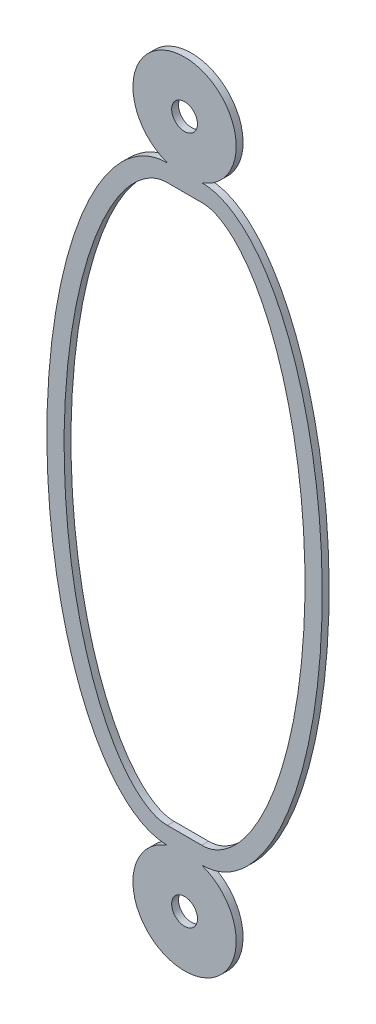
ISO-10303-21;
HEADER;
FILE_DESCRIPTION(('STEP AP214'),'2;1');
FILE_NAME('part.step','',(''),(''),'','','');
FILE_SCHEMA(('AUTOMOTIVE_DESIGN { 1 0 10303 214 1 1 1 1 }'));
ENDSEC;
DATA;
#1=APPLICATION_CONTEXT('core data for automotive mechanical design processes');
#2=APPLICATION_PROTOCOL_DEFINITION('international standard','automotive_design',2000,#1);
#3=PRODUCT_CONTEXT('',#1,'mechanical');
#4=PRODUCT('Part','Part','',(#3));
#5=PRODUCT_RELATED_PRODUCT_CATEGORY('part','',(#4));
#6=PRODUCT_DEFINITION_FORMATION('','',#4);
#7=PRODUCT_DEFINITION_CONTEXT('part definition',#1,'design');
#8=PRODUCT_DEFINITION('design','',#6,#7);
#9=PRODUCT_DEFINITION_SHAPE('','',#8);
#10=(LENGTH_UNIT() NAMED_UNIT(*) SI_UNIT(.MILLI.,.METRE.));
#11=(NAMED_UNIT(*) PLANE_ANGLE_UNIT() SI_UNIT($,.RADIAN.));
#12=(NAMED_UNIT(*) SI_UNIT($,.STERADIAN.) SOLID_ANGLE_UNIT());
#13=UNCERTAINTY_MEASURE_WITH_UNIT(LENGTH_MEASURE(1.E-05),#10,'distance_accuracy_value','');
#14=(GEOMETRIC_REPRESENTATION_CONTEXT(3) GLOBAL_UNCERTAINTY_ASSIGNED_CONTEXT((#13)) GLOBAL_UNIT_ASSIGNED_CONTEXT((#10,
#11,#12)) REPRESENTATION_CONTEXT('',''));
#15=CARTESIAN_POINT('',(0.,0.,0.));
#16=DIRECTION('',(0.,0.,1.));
#17=DIRECTION('',(1.,0.,0.));
#18=AXIS2_PLACEMENT_3D('',#15,#16,#17);
#19=CARTESIAN_POINT('',(-0.500000000000001,0.,0.1));
#20=DIRECTION('',(0.,0.,1.));
#21=DIRECTION('',(1.,0.,0.));
#22=AXIS2_PLACEMENT_3D('',#19,#20,#21);
#23=PLANE('',#22);
#24=CARTESIAN_POINT('',(0.,10.,0.1));
#25=DIRECTION('',(0.,0.,1.));
#26=DIRECTION('',(1.,0.,0.));
#27=AXIS2_PLACEMENT_3D('',#24,#25,#26);
#28=CIRCLE('',#27,0.375000000000001);
#29=CARTESIAN_POINT('',(0.375,10.,0.1));
#30=VERTEX_POINT('',#29);
#31=EDGE_CURVE('E184',#30,#30,#28,.T.);
#32=ORIENTED_EDGE('',*,*,#31,.F.);
#33=EDGE_LOOP('',(#32));
#34=FACE_BOUND('',#33,.T.);
#35=CARTESIAN_POINT('',(-0.500000000000001,0.,0.1));
#36=DIRECTION('',(0.,0.,1.));
#37=DIRECTION('',(0.,1.,0.));
#38=AXIS2_PLACEMENT_3D('',#35,#36,#37);
#39=ELLIPSE('',#38,8.5857864376269,3.5);
#40=CARTESIAN_POINT('',(-0.500000000000002,8.5857864376269,0.1));
#41=VERTEX_POINT('',#40);
#42=CARTESIAN_POINT('',(-0.500000000000001,-8.5857864376269,0.1));
#43=VERTEX_POINT('',#42);
#44=EDGE_CURVE('E190',#41,#43,#39,.T.);
#45=ORIENTED_EDGE('',*,*,#44,.T.);
#46=CARTESIAN_POINT('',(0.,-10.,0.1));
#47=DIRECTION('',(0.,0.,1.));
#48=DIRECTION('',(1.,0.,0.));
#49=AXIS2_PLACEMENT_3D('',#46,#47,#48);
#50=CIRCLE('',#49,1.5);
#51=CARTESIAN_POINT('',(0.499999999999999,-8.5857864376269,0.1));
#52=VERTEX_POINT('',#51);
#53=EDGE_CURVE('E177',#43,#52,#50,.T.);
#54=ORIENTED_EDGE('',*,*,#53,.T.);
#55=CARTESIAN_POINT('',(0.499999999999999,0.,0.1));
#56=DIRECTION('',(0.,0.,1.));
#57=DIRECTION('',(0.,1.,0.));
#58=AXIS2_PLACEMENT_3D('',#55,#56,#57);
#59=ELLIPSE('',#58,8.5857864376269,3.5);
#60=CARTESIAN_POINT('',(0.499999999999999,8.5857864376269,0.1));
#61=VERTEX_POINT('',#60);
#62=EDGE_CURVE('E172',#52,#61,#59,.T.);
#63=ORIENTED_EDGE('',*,*,#62,.T.);
#64=CARTESIAN_POINT('',(0.,10.,0.1));
#65=DIRECTION('',(0.,0.,1.));
#66=DIRECTION('',(1.,0.,0.));
#67=AXIS2_PLACEMENT_3D('',#64,#65,#66);
#68=CIRCLE('',#67,1.5);
#69=EDGE_CURVE('E176',#61,#41,#68,.T.);
#70=ORIENTED_EDGE('',*,*,#69,.T.);
#71=EDGE_LOOP('',(#45,#54,#63,#70));
#72=FACE_BOUND('',#71,.T.);
#73=CARTESIAN_POINT('',(0.,-10.,0.1));
#74=DIRECTION('',(0.,0.,1.));
#75=DIRECTION('',(1.,0.,0.));
#76=AXIS2_PLACEMENT_3D('',#73,#74,#75);
#77=CIRCLE('',#76,0.375);
#78=CARTESIAN_POINT('',(0.375000000000006,-10.,0.1));
#79=VERTEX_POINT('',#78);
#80=EDGE_CURVE('E217',#79,#79,#77,.T.);
#81=ORIENTED_EDGE('',*,*,#80,.F.);
#82=EDGE_LOOP('',(#81));
#83=FACE_BOUND('',#82,.T.);
#84=DIRECTION('',(1.,0.,0.));
#85=VECTOR('',#84,1.);
#86=CARTESIAN_POINT('',(-0.500000000000001,-8.08578643762691,0.1));
#87=LINE('',#86,#85);
#88=CARTESIAN_POINT('',(-0.500000000000001,-8.08578643762691,0.1));
#89=VERTEX_POINT('',#88);
#90=CARTESIAN_POINT('',(0.5,-8.0857864376269,0.1));
#91=VERTEX_POINT('',#90);
#92=EDGE_CURVE('E110',#89,#91,#87,.T.);
#93=ORIENTED_EDGE('',*,*,#92,.F.);
#94=CARTESIAN_POINT('',(-0.500000000000001,8.0857864376269,0.1));
#95=CARTESIAN_POINT('',(-0.659147925726962,8.0857864376269,0.1));
#96=CARTESIAN_POINT('',(-0.94590993674264,8.01836726312393,0.1));
#97=CARTESIAN_POINT('',(-1.48190681272366,7.63575974394931,0.1));
#98=CARTESIAN_POINT('',(-2.02462270649366,6.92767469065392,0.1));
#99=CARTESIAN_POINT('',(-2.69255409919081,5.58946200738258,0.1));
#100=CARTESIAN_POINT('',(-3.32190291475356,3.2913111898813,0.1));
#101=CARTESIAN_POINT('',(-3.58904854262322,0.,0.1));
#102=CARTESIAN_POINT('',(-3.32190291475355,-3.2913111898813,0.1));
#103=CARTESIAN_POINT('',(-2.69255409919081,-5.58946200738258,0.1));
#104=CARTESIAN_POINT('',(-2.02462270649366,-6.92767469065392,0.1));
#105=CARTESIAN_POINT('',(-1.48190681272366,-7.63575974394932,0.1));
#106=CARTESIAN_POINT('',(-0.945909936742641,-8.01836726312393,0.1));
#107=CARTESIAN_POINT('',(-0.659147925726963,-8.08578643762691,0.1));
#108=CARTESIAN_POINT('',(-0.500000000000001,-8.08578643762691,0.1));
#109=B_SPLINE_CURVE_WITH_KNOTS('',3,(#94,#95,#96,#97,#98,#99,#100,#101,#102,#103,#104,#105,#106,
#107,#108),.UNSPECIFIED.,.F.,.F.,(4,1,1,1,1,1,1,1,1,1,1,1,4),(0.,0.196349540849362,
0.392699081698724,0.589048622548086,0.785398163397448,1.17809724509617,1.5707963267949,
1.96349540849362,2.35619449019234,2.55254403104171,2.74889357189107,2.94524311274043,
3.14159265358979),.UNSPECIFIED.);
#110=CARTESIAN_POINT('',(-0.500000000000001,8.0857864376269,0.1));
#111=VERTEX_POINT('',#110);
#112=EDGE_CURVE('E102',#111,#89,#109,.T.);
#113=ORIENTED_EDGE('',*,*,#112,.F.);
#114=DIRECTION('',(-1.,0.,0.));
#115=VECTOR('',#114,1.);
#116=CARTESIAN_POINT('',(-0.500000000000001,8.0857864376269,0.1));
#117=LINE('',#116,#115);
#118=CARTESIAN_POINT('',(0.5,8.0857864376269,0.1));
#119=VERTEX_POINT('',#118);
#120=EDGE_CURVE('E124',#119,#111,#117,.T.);
#121=ORIENTED_EDGE('',*,*,#120,.F.);
#122=CARTESIAN_POINT('',(0.5,-8.0857864376269,0.1));
#123=CARTESIAN_POINT('',(0.659147925726961,-8.0857864376269,0.1));
#124=CARTESIAN_POINT('',(0.94590993674264,-8.01836726312392,0.1));
#125=CARTESIAN_POINT('',(1.48190681272366,-7.63575974394931,0.1));
#126=CARTESIAN_POINT('',(2.02462270649366,-6.92767469065392,0.1));
#127=CARTESIAN_POINT('',(2.69255409919081,-5.58946200738257,0.1));
#128=CARTESIAN_POINT('',(3.32190291475355,-3.2913111898813,0.1));
#129=CARTESIAN_POINT('',(3.58904854262322,0.,0.1));
#130=CARTESIAN_POINT('',(3.32190291475355,3.2913111898813,0.1));
#131=CARTESIAN_POINT('',(2.6925540991908,5.58946200738258,0.1));
#132=CARTESIAN_POINT('',(2.02462270649366,6.92767469065392,0.1));
#133=CARTESIAN_POINT('',(1.48190681272366,7.63575974394931,0.1));
#134=CARTESIAN_POINT('',(0.945909936742639,8.01836726312393,0.1));
#135=CARTESIAN_POINT('',(0.659147925726961,8.0857864376269,0.1));
#136=CARTESIAN_POINT('',(0.499999999999999,8.0857864376269,0.1));
#137=B_SPLINE_CURVE_WITH_KNOTS('',3,(#122,#123,#124,#125,#126,#127,#128,#129,#130,#131,#132,
#133,#134,#135,#136),.UNSPECIFIED.,.F.,.F.,(4,1,1,1,1,1,1,1,1,1,1,1,4),(-3.14159265358979,
-2.94524311274043,-2.74889357189107,-2.55254403104171,-2.35619449019234,-1.96349540849362,
-1.5707963267949,-1.17809724509617,-0.785398163397448,-0.589048622548086,-0.392699081698724,
-0.196349540849362,0.),.UNSPECIFIED.);
#138=EDGE_CURVE('E122',#91,#119,#137,.T.);
#139=ORIENTED_EDGE('',*,*,#138,.F.);
#140=EDGE_LOOP('',(#93,#113,#121,#139));
#141=FACE_BOUND('',#140,.T.);
#142=ADVANCED_FACE('F36',(#34,#72,#83,#141),#23,.T.);
#143=CARTESIAN_POINT('',(-0.500000000000001,0.,-0.1));
#144=DIRECTION('',(0.,0.,1.));
#145=DIRECTION('',(1.,0.,0.));
#146=AXIS2_PLACEMENT_3D('',#143,#144,#145);
#147=PLANE('',#146);
#148=CARTESIAN_POINT('',(0.,-10.,-0.1));
#149=DIRECTION('',(0.,0.,1.));
#150=DIRECTION('',(1.,0.,0.));
#151=AXIS2_PLACEMENT_3D('',#148,#149,#150);
#152=CIRCLE('',#151,0.375);
#153=CARTESIAN_POINT('',(0.375000000000006,-10.,-0.1));
#154=VERTEX_POINT('',#153);
#155=EDGE_CURVE('E118',#154,#154,#152,.T.);
#156=ORIENTED_EDGE('',*,*,#155,.T.);
#157=EDGE_LOOP('',(#156));
#158=FACE_BOUND('',#157,.T.);
#159=CARTESIAN_POINT('',(0.,10.,-0.1));
#160=DIRECTION('',(0.,0.,1.));
#161=DIRECTION('',(1.,0.,0.));
#162=AXIS2_PLACEMENT_3D('',#159,#160,#161);
#163=CIRCLE('',#162,0.375000000000001);
#164=CARTESIAN_POINT('',(0.375,10.,-0.1));
#165=VERTEX_POINT('',#164);
#166=EDGE_CURVE('E214',#165,#165,#163,.T.);
#167=ORIENTED_EDGE('',*,*,#166,.T.);
#168=EDGE_LOOP('',(#167));
#169=FACE_BOUND('',#168,.T.);
#170=CARTESIAN_POINT('',(-0.500000000000001,0.,-0.1));
#171=DIRECTION('',(0.,0.,1.));
#172=DIRECTION('',(0.,1.,0.));
#173=AXIS2_PLACEMENT_3D('',#170,#171,#172);
#174=ELLIPSE('',#173,8.5857864376269,3.5);
#175=CARTESIAN_POINT('',(-0.500000000000002,8.5857864376269,-0.1));
#176=VERTEX_POINT('',#175);
#177=CARTESIAN_POINT('',(-0.500000000000001,-8.5857864376269,-0.1));
#178=VERTEX_POINT('',#177);
#179=EDGE_CURVE('E180',#176,#178,#174,.T.);
#180=ORIENTED_EDGE('',*,*,#179,.F.);
#181=CARTESIAN_POINT('',(0.,10.,-0.1));
#182=DIRECTION('',(0.,0.,1.));
#183=DIRECTION('',(1.,0.,0.));
#184=AXIS2_PLACEMENT_3D('',#181,#182,#183);
#185=CIRCLE('',#184,1.5);
#186=CARTESIAN_POINT('',(0.499999999999999,8.5857864376269,-0.1));
#187=VERTEX_POINT('',#186);
#188=EDGE_CURVE('E188',#187,#176,#185,.T.);
#189=ORIENTED_EDGE('',*,*,#188,.F.);
#190=CARTESIAN_POINT('',(0.499999999999999,0.,-0.1));
#191=DIRECTION('',(0.,0.,1.));
#192=DIRECTION('',(0.,1.,0.));
#193=AXIS2_PLACEMENT_3D('',#190,#191,#192);
#194=ELLIPSE('',#193,8.5857864376269,3.5);
#195=CARTESIAN_POINT('',(0.499999999999999,-8.5857864376269,-0.1));
#196=VERTEX_POINT('',#195);
#197=EDGE_CURVE('E186',#196,#187,#194,.T.);
#198=ORIENTED_EDGE('',*,*,#197,.F.);
#199=CARTESIAN_POINT('',(0.,-10.,-0.1));
#200=DIRECTION('',(0.,0.,1.));
#201=DIRECTION('',(1.,0.,0.));
#202=AXIS2_PLACEMENT_3D('',#199,#200,#201);
#203=CIRCLE('',#202,1.5);
#204=EDGE_CURVE('E183',#178,#196,#203,.T.);
#205=ORIENTED_EDGE('',*,*,#204,.F.);
#206=EDGE_LOOP('',(#180,#189,#198,#205));
#207=FACE_BOUND('',#206,.T.);
#208=CARTESIAN_POINT('',(-0.500000000000001,8.0857864376269,-0.1));
#209=CARTESIAN_POINT('',(-0.659147925726962,8.0857864376269,-0.1));
#210=CARTESIAN_POINT('',(-0.94590993674264,8.01836726312393,-0.1));
#211=CARTESIAN_POINT('',(-1.48190681272366,7.63575974394931,-0.1));
#212=CARTESIAN_POINT('',(-2.02462270649366,6.92767469065392,-0.1));
#213=CARTESIAN_POINT('',(-2.69255409919081,5.58946200738258,-0.1));
#214=CARTESIAN_POINT('',(-3.32190291475356,3.2913111898813,-0.1));
#215=CARTESIAN_POINT('',(-3.58904854262322,0.,-0.1));
#216=CARTESIAN_POINT('',(-3.32190291475355,-3.2913111898813,-0.1));
#217=CARTESIAN_POINT('',(-2.69255409919081,-5.58946200738258,-0.1));
#218=CARTESIAN_POINT('',(-2.02462270649366,-6.92767469065392,-0.1));
#219=CARTESIAN_POINT('',(-1.48190681272366,-7.63575974394932,-0.1));
#220=CARTESIAN_POINT('',(-0.945909936742641,-8.01836726312393,-0.1));
#221=CARTESIAN_POINT('',(-0.659147925726963,-8.08578643762691,-0.1));
#222=CARTESIAN_POINT('',(-0.500000000000001,-8.08578643762691,-0.1));
#223=B_SPLINE_CURVE_WITH_KNOTS('',3,(#208,#209,#210,#211,#212,#213,#214,#215,#216,#217,#218,
#219,#220,#221,#222),.UNSPECIFIED.,.F.,.F.,(4,1,1,1,1,1,1,1,1,1,1,1,4),(0.,0.196349540849362,
0.392699081698724,0.589048622548086,0.785398163397448,1.17809724509617,1.5707963267949,
1.96349540849362,2.35619449019234,2.55254403104171,2.74889357189107,2.94524311274043,
3.14159265358979),.UNSPECIFIED.);
#224=CARTESIAN_POINT('',(-0.500000000000001,8.0857864376269,-0.1));
#225=VERTEX_POINT('',#224);
#226=CARTESIAN_POINT('',(-0.500000000000001,-8.08578643762691,-0.1));
#227=VERTEX_POINT('',#226);
#228=EDGE_CURVE('E60',#225,#227,#223,.T.);
#229=ORIENTED_EDGE('',*,*,#228,.T.);
#230=DIRECTION('',(1.,0.,0.));
#231=VECTOR('',#230,1.);
#232=CARTESIAN_POINT('',(-0.500000000000001,-8.08578643762691,-0.1));
#233=LINE('',#232,#231);
#234=CARTESIAN_POINT('',(0.5,-8.0857864376269,-0.1));
#235=VERTEX_POINT('',#234);
#236=EDGE_CURVE('E117',#227,#235,#233,.T.);
#237=ORIENTED_EDGE('',*,*,#236,.T.);
#238=CARTESIAN_POINT('',(0.5,-8.0857864376269,-0.1));
#239=CARTESIAN_POINT('',(0.659147925726961,-8.0857864376269,-0.1));
#240=CARTESIAN_POINT('',(0.94590993674264,-8.01836726312392,-0.1));
#241=CARTESIAN_POINT('',(1.48190681272366,-7.63575974394931,-0.1));
#242=CARTESIAN_POINT('',(2.02462270649366,-6.92767469065392,-0.1));
#243=CARTESIAN_POINT('',(2.69255409919081,-5.58946200738257,-0.1));
#244=CARTESIAN_POINT('',(3.32190291475355,-3.2913111898813,-0.1));
#245=CARTESIAN_POINT('',(3.58904854262322,0.,-0.1));
#246=CARTESIAN_POINT('',(3.32190291475355,3.2913111898813,-0.1));
#247=CARTESIAN_POINT('',(2.6925540991908,5.58946200738258,-0.1));
#248=CARTESIAN_POINT('',(2.02462270649366,6.92767469065392,-0.1));
#249=CARTESIAN_POINT('',(1.48190681272366,7.63575974394931,-0.1));
#250=CARTESIAN_POINT('',(0.945909936742639,8.01836726312393,-0.1));
#251=CARTESIAN_POINT('',(0.659147925726961,8.0857864376269,-0.1));
#252=CARTESIAN_POINT('',(0.499999999999999,8.0857864376269,-0.1));
#253=B_SPLINE_CURVE_WITH_KNOTS('',3,(#238,#239,#240,#241,#242,#243,#244,#245,#246,#247,#248,
#249,#250,#251,#252),.UNSPECIFIED.,.F.,.F.,(4,1,1,1,1,1,1,1,1,1,1,1,4),(-3.14159265358979,
-2.94524311274043,-2.74889357189107,-2.55254403104171,-2.35619449019234,-1.96349540849362,
-1.5707963267949,-1.17809724509617,-0.785398163397448,-0.589048622548086,-0.392699081698724,
-0.196349540849362,0.),.UNSPECIFIED.);
#254=CARTESIAN_POINT('',(0.499999999999999,8.0857864376269,-0.1));
#255=VERTEX_POINT('',#254);
#256=EDGE_CURVE('E229',#235,#255,#253,.T.);
#257=ORIENTED_EDGE('',*,*,#256,.T.);
#258=DIRECTION('',(-1.,0.,0.));
#259=VECTOR('',#258,1.);
#260=CARTESIAN_POINT('',(-0.500000000000001,8.0857864376269,-0.1));
#261=LINE('',#260,#259);
#262=EDGE_CURVE('E111',#255,#225,#261,.T.);
#263=ORIENTED_EDGE('',*,*,#262,.T.);
#264=EDGE_LOOP('',(#229,#237,#257,#263));
#265=FACE_BOUND('',#264,.T.);
#266=ADVANCED_FACE('F159',(#158,#169,#207,#265),#147,.F.);
#267=DIRECTION('',(0.,0.,-1.));
#268=VECTOR('',#267,1.);
#269=SURFACE_OF_LINEAR_EXTRUSION('',#39,#268);
#270=ORIENTED_EDGE('',*,*,#179,.T.);
#271=DIRECTION('',(0.,0.,-1.));
#272=VECTOR('',#271,1.);
#273=CARTESIAN_POINT('',(-0.500000000000001,-8.5857864376269,0.1));
#274=LINE('',#273,#272);
#275=EDGE_CURVE('E11',#43,#178,#274,.T.);
#276=ORIENTED_EDGE('',*,*,#275,.F.);
#277=ORIENTED_EDGE('',*,*,#44,.F.);
#278=DIRECTION('',(0.,0.,-1.));
#279=VECTOR('',#278,1.);
#280=CARTESIAN_POINT('',(-0.500000000000002,8.5857864376269,0.1));
#281=LINE('',#280,#279);
#282=EDGE_CURVE('E179',#41,#176,#281,.T.);
#283=ORIENTED_EDGE('',*,*,#282,.T.);
#284=EDGE_LOOP('',(#270,#276,#277,#283));
#285=FACE_BOUND('',#284,.T.);
#286=ADVANCED_FACE('F38',(#285),#269,.F.);
#287=CARTESIAN_POINT('',(0.,-10.,0.1));
#288=DIRECTION('',(0.,0.,-1.));
#289=DIRECTION('',(-1.,0.,0.));
#290=AXIS2_PLACEMENT_3D('',#287,#288,#289);
#291=CYLINDRICAL_SURFACE('',#290,1.5);
#292=ORIENTED_EDGE('',*,*,#204,.T.);
#293=DIRECTION('',(0.,0.,-1.));
#294=VECTOR('',#293,1.);
#295=CARTESIAN_POINT('',(0.499999999999999,-8.5857864376269,0.1));
#296=LINE('',#295,#294);
#297=EDGE_CURVE('E45',#52,#196,#296,.T.);
#298=ORIENTED_EDGE('',*,*,#297,.F.);
#299=ORIENTED_EDGE('',*,*,#53,.F.);
#300=ORIENTED_EDGE('',*,*,#275,.T.);
#301=EDGE_LOOP('',(#292,#298,#299,#300));
#302=FACE_BOUND('',#301,.T.);
#303=ADVANCED_FACE('F170',(#302),#291,.T.);
#304=DIRECTION('',(0.,0.,-1.));
#305=VECTOR('',#304,1.);
#306=SURFACE_OF_LINEAR_EXTRUSION('',#59,#305);
#307=ORIENTED_EDGE('',*,*,#197,.T.);
#308=DIRECTION('',(0.,0.,-1.));
#309=VECTOR('',#308,1.);
#310=CARTESIAN_POINT('',(0.499999999999999,8.5857864376269,0.1));
#311=LINE('',#310,#309);
#312=EDGE_CURVE('E193',#61,#187,#311,.T.);
#313=ORIENTED_EDGE('',*,*,#312,.F.);
#314=ORIENTED_EDGE('',*,*,#62,.F.);
#315=ORIENTED_EDGE('',*,*,#297,.T.);
#316=EDGE_LOOP('',(#307,#313,#314,#315));
#317=FACE_BOUND('',#316,.T.);
#318=ADVANCED_FACE('F166',(#317),#306,.F.);
#319=CARTESIAN_POINT('',(0.,10.,0.1));
#320=DIRECTION('',(0.,0.,-1.));
#321=DIRECTION('',(-1.,0.,0.));
#322=AXIS2_PLACEMENT_3D('',#319,#320,#321);
#323=CYLINDRICAL_SURFACE('',#322,1.5);
#324=ORIENTED_EDGE('',*,*,#188,.T.);
#325=ORIENTED_EDGE('',*,*,#282,.F.);
#326=ORIENTED_EDGE('',*,*,#69,.F.);
#327=ORIENTED_EDGE('',*,*,#312,.T.);
#328=EDGE_LOOP('',(#324,#325,#326,#327));
#329=FACE_BOUND('',#328,.T.);
#330=ADVANCED_FACE('F155',(#329),#323,.T.);
#331=CARTESIAN_POINT('',(0.,10.,0.1));
#332=DIRECTION('',(0.,0.,-1.));
#333=DIRECTION('',(-1.,0.,0.));
#334=AXIS2_PLACEMENT_3D('',#331,#332,#333);
#335=CYLINDRICAL_SURFACE('',#334,0.375000000000001);
#336=ORIENTED_EDGE('',*,*,#31,.T.);
#337=EDGE_LOOP('',(#336));
#338=FACE_BOUND('',#337,.T.);
#339=ORIENTED_EDGE('',*,*,#166,.F.);
#340=EDGE_LOOP('',(#339));
#341=FACE_BOUND('',#340,.T.);
#342=ADVANCED_FACE('F151',(#338,#341),#335,.F.);
#343=CARTESIAN_POINT('',(0.,-10.,0.1));
#344=DIRECTION('',(0.,0.,-1.));
#345=DIRECTION('',(-1.,0.,0.));
#346=AXIS2_PLACEMENT_3D('',#343,#344,#345);
#347=CYLINDRICAL_SURFACE('',#346,0.375);
#348=ORIENTED_EDGE('',*,*,#80,.T.);
#349=EDGE_LOOP('',(#348));
#350=FACE_BOUND('',#349,.T.);
#351=ORIENTED_EDGE('',*,*,#155,.F.);
#352=EDGE_LOOP('',(#351));
#353=FACE_BOUND('',#352,.T.);
#354=ADVANCED_FACE('F148',(#350,#353),#347,.F.);
#355=DIRECTION('',(0.,0.,-1.));
#356=VECTOR('',#355,1.);
#357=SURFACE_OF_LINEAR_EXTRUSION('',#109,#356);
#358=ORIENTED_EDGE('',*,*,#228,.F.);
#359=DIRECTION('',(0.,0.,-1.));
#360=VECTOR('',#359,1.);
#361=CARTESIAN_POINT('',(-0.500000000000001,8.0857864376269,0.1));
#362=LINE('',#361,#360);
#363=EDGE_CURVE('E106',#111,#225,#362,.T.);
#364=ORIENTED_EDGE('',*,*,#363,.F.);
#365=ORIENTED_EDGE('',*,*,#112,.T.);
#366=DIRECTION('',(0.,0.,-1.));
#367=VECTOR('',#366,1.);
#368=CARTESIAN_POINT('',(-0.500000000000001,-8.08578643762691,0.1));
#369=LINE('',#368,#367);
#370=EDGE_CURVE('E105',#89,#227,#369,.T.);
#371=ORIENTED_EDGE('',*,*,#370,.T.);
#372=EDGE_LOOP('',(#358,#364,#365,#371));
#373=FACE_BOUND('',#372,.T.);
#374=ADVANCED_FACE('F104',(#373),#357,.T.);
#375=CARTESIAN_POINT('',(-0.500000000000001,-8.08578643762691,0.1));
#376=DIRECTION('',(0.,1.,0.));
#377=DIRECTION('',(-1.,0.,0.));
#378=AXIS2_PLACEMENT_3D('',#375,#376,#377);
#379=PLANE('',#378);
#380=ORIENTED_EDGE('',*,*,#236,.F.);
#381=ORIENTED_EDGE('',*,*,#370,.F.);
#382=ORIENTED_EDGE('',*,*,#92,.T.);
#383=DIRECTION('',(0.,0.,-1.));
#384=VECTOR('',#383,1.);
#385=CARTESIAN_POINT('',(0.5,-8.0857864376269,0.1));
#386=LINE('',#385,#384);
#387=EDGE_CURVE('E119',#91,#235,#386,.T.);
#388=ORIENTED_EDGE('',*,*,#387,.T.);
#389=EDGE_LOOP('',(#380,#381,#382,#388));
#390=FACE_BOUND('',#389,.T.);
#391=ADVANCED_FACE('F114',(#390),#379,.T.);
#392=DIRECTION('',(0.,0.,-1.));
#393=VECTOR('',#392,1.);
#394=SURFACE_OF_LINEAR_EXTRUSION('',#137,#393);
#395=ORIENTED_EDGE('',*,*,#256,.F.);
#396=ORIENTED_EDGE('',*,*,#387,.F.);
#397=ORIENTED_EDGE('',*,*,#138,.T.);
#398=DIRECTION('',(0.,0.,-1.));
#399=VECTOR('',#398,1.);
#400=CARTESIAN_POINT('',(0.499999999999999,8.0857864376269,0.1));
#401=LINE('',#400,#399);
#402=EDGE_CURVE('E52',#119,#255,#401,.T.);
#403=ORIENTED_EDGE('',*,*,#402,.T.);
#404=EDGE_LOOP('',(#395,#396,#397,#403));
#405=FACE_BOUND('',#404,.T.);
#406=ADVANCED_FACE('F138',(#405),#394,.T.);
#407=CARTESIAN_POINT('',(-0.500000000000001,8.0857864376269,0.1));
#408=DIRECTION('',(0.,-1.,0.));
#409=DIRECTION('',(0.,0.,-1.));
#410=AXIS2_PLACEMENT_3D('',#407,#408,#409);
#411=PLANE('',#410);
#412=ORIENTED_EDGE('',*,*,#262,.F.);
#413=ORIENTED_EDGE('',*,*,#402,.F.);
#414=ORIENTED_EDGE('',*,*,#120,.T.);
#415=ORIENTED_EDGE('',*,*,#363,.T.);
#416=EDGE_LOOP('',(#412,#413,#414,#415));
#417=FACE_BOUND('',#416,.T.);
#418=ADVANCED_FACE('F142',(#417),#411,.T.);
#419=CLOSED_SHELL('',(#142,#266,#286,#303,#318,#330,#342,#354,#374,#391,#406,#418));
#420=MANIFOLD_SOLID_BREP('B2',#419);
#421=ADVANCED_BREP_SHAPE_REPRESENTATION('',(#18,#420),#14);
#422=SHAPE_DEFINITION_REPRESENTATION(#9,#421);
ENDSEC;
END-ISO-10303-21;
